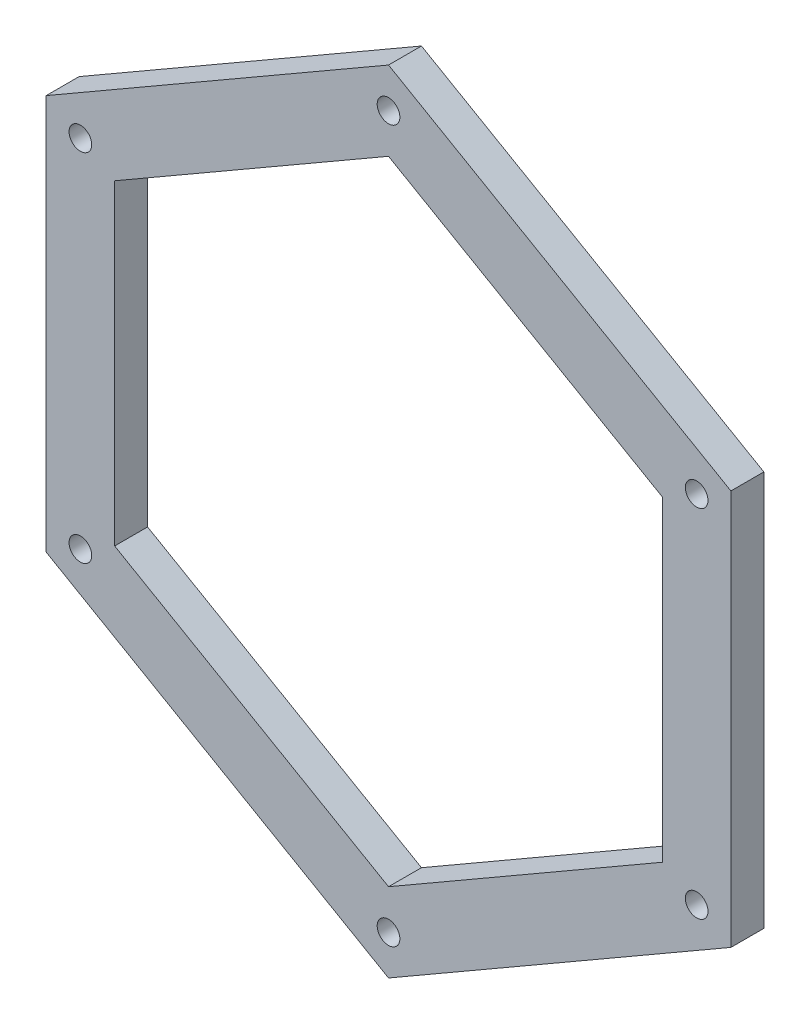
ISO-10303-21;
HEADER;
FILE_DESCRIPTION(('STEP AP214'),'2;1');
FILE_NAME('part.step','',(''),(''),'','','');
FILE_SCHEMA(('AUTOMOTIVE_DESIGN { 1 0 10303 214 1 1 1 1 }'));
ENDSEC;
DATA;
#1=APPLICATION_CONTEXT('core data for automotive mechanical design processes');
#2=APPLICATION_PROTOCOL_DEFINITION('international standard','automotive_design',2000,#1);
#3=PRODUCT_CONTEXT('',#1,'mechanical');
#4=PRODUCT('Part','Part','',(#3));
#5=PRODUCT_RELATED_PRODUCT_CATEGORY('part','',(#4));
#6=PRODUCT_DEFINITION_FORMATION('','',#4);
#7=PRODUCT_DEFINITION_CONTEXT('part definition',#1,'design');
#8=PRODUCT_DEFINITION('design','',#6,#7);
#9=PRODUCT_DEFINITION_SHAPE('','',#8);
#10=(LENGTH_UNIT() NAMED_UNIT(*) SI_UNIT(.MILLI.,.METRE.));
#11=(NAMED_UNIT(*) PLANE_ANGLE_UNIT() SI_UNIT($,.RADIAN.));
#12=(NAMED_UNIT(*) SI_UNIT($,.STERADIAN.) SOLID_ANGLE_UNIT());
#13=UNCERTAINTY_MEASURE_WITH_UNIT(LENGTH_MEASURE(1.E-05),#10,'distance_accuracy_value','');
#14=(GEOMETRIC_REPRESENTATION_CONTEXT(3) GLOBAL_UNCERTAINTY_ASSIGNED_CONTEXT((#13)) GLOBAL_UNIT_ASSIGNED_CONTEXT((#10,
#11,#12)) REPRESENTATION_CONTEXT('',''));
#15=CARTESIAN_POINT('',(0.,0.,0.));
#16=DIRECTION('',(0.,0.,1.));
#17=DIRECTION('',(1.,0.,0.));
#18=AXIS2_PLACEMENT_3D('',#15,#16,#17);
#19=CARTESIAN_POINT('',(0.,0.,3.175));
#20=DIRECTION('',(0.,0.,1.));
#21=DIRECTION('',(1.,0.,0.));
#22=AXIS2_PLACEMENT_3D('',#19,#20,#21);
#23=PLANE('',#22);
#24=CARTESIAN_POINT('',(0.,-34.29,3.175));
#25=DIRECTION('',(0.,0.,1.));
#26=DIRECTION('',(1.,0.,0.));
#27=AXIS2_PLACEMENT_3D('',#24,#25,#26);
#28=CIRCLE('',#27,1.0922);
#29=CARTESIAN_POINT('',(1.09220000000002,-34.29,3.175));
#30=VERTEX_POINT('',#29);
#31=EDGE_CURVE('E330',#30,#30,#28,.T.);
#32=ORIENTED_EDGE('',*,*,#31,.F.);
#33=EDGE_LOOP('',(#32));
#34=FACE_BOUND('',#33,.T.);
#35=CARTESIAN_POINT('',(29.6960110957684,17.145,3.175));
#36=DIRECTION('',(0.,0.,1.));
#37=DIRECTION('',(1.,0.,0.));
#38=AXIS2_PLACEMENT_3D('',#35,#36,#37);
#39=CIRCLE('',#38,1.0922);
#40=CARTESIAN_POINT('',(30.7882110957684,17.145,3.175));
#41=VERTEX_POINT('',#40);
#42=EDGE_CURVE('E342',#41,#41,#39,.T.);
#43=ORIENTED_EDGE('',*,*,#42,.F.);
#44=EDGE_LOOP('',(#43));
#45=FACE_BOUND('',#44,.T.);
#46=DIRECTION('',(-0.866025403784438,0.5,0.));
#47=VECTOR('',#46,1.);
#48=CARTESIAN_POINT('',(26.3964543073497,15.24,3.175));
#49=LINE('',#48,#47);
#50=CARTESIAN_POINT('',(26.3964543073497,15.24,3.175));
#51=VERTEX_POINT('',#50);
#52=CARTESIAN_POINT('',(0.,30.48,3.175));
#53=VERTEX_POINT('',#52);
#54=EDGE_CURVE('E136',#51,#53,#49,.T.);
#55=ORIENTED_EDGE('',*,*,#54,.F.);
#56=DIRECTION('',(0.,1.,0.));
#57=VECTOR('',#56,1.);
#58=CARTESIAN_POINT('',(26.3964543073497,-15.24,3.175));
#59=LINE('',#58,#57);
#60=CARTESIAN_POINT('',(26.3964543073497,-15.24,3.175));
#61=VERTEX_POINT('',#60);
#62=EDGE_CURVE('E128',#61,#51,#59,.T.);
#63=ORIENTED_EDGE('',*,*,#62,.F.);
#64=DIRECTION('',(0.866025403784439,0.5,0.));
#65=VECTOR('',#64,1.);
#66=CARTESIAN_POINT('',(0.,-30.48,3.175));
#67=LINE('',#66,#65);
#68=CARTESIAN_POINT('',(0.,-30.48,3.175));
#69=VERTEX_POINT('',#68);
#70=EDGE_CURVE('E159',#69,#61,#67,.T.);
#71=ORIENTED_EDGE('',*,*,#70,.F.);
#72=DIRECTION('',(0.866025403784439,-0.5,0.));
#73=VECTOR('',#72,1.);
#74=CARTESIAN_POINT('',(-26.3964543073497,-15.24,3.175));
#75=LINE('',#74,#73);
#76=CARTESIAN_POINT('',(-26.3964543073497,-15.24,3.175));
#77=VERTEX_POINT('',#76);
#78=EDGE_CURVE('E157',#77,#69,#75,.T.);
#79=ORIENTED_EDGE('',*,*,#78,.F.);
#80=DIRECTION('',(0.,-1.,0.));
#81=VECTOR('',#80,1.);
#82=CARTESIAN_POINT('',(-26.3964543073497,15.24,3.175));
#83=LINE('',#82,#81);
#84=CARTESIAN_POINT('',(-26.3964543073497,15.24,3.175));
#85=VERTEX_POINT('',#84);
#86=EDGE_CURVE('E152',#85,#77,#83,.T.);
#87=ORIENTED_EDGE('',*,*,#86,.F.);
#88=DIRECTION('',(-0.866025403784439,-0.5,0.));
#89=VECTOR('',#88,1.);
#90=CARTESIAN_POINT('',(0.,30.48,3.175));
#91=LINE('',#90,#89);
#92=EDGE_CURVE('E150',#53,#85,#91,.T.);
#93=ORIENTED_EDGE('',*,*,#92,.F.);
#94=EDGE_LOOP('',(#55,#63,#71,#79,#87,#93));
#95=FACE_BOUND('',#94,.T.);
#96=CARTESIAN_POINT('',(-29.6960110957684,17.145,3.175));
#97=DIRECTION('',(0.,0.,1.));
#98=DIRECTION('',(1.,0.,0.));
#99=AXIS2_PLACEMENT_3D('',#96,#97,#98);
#100=CIRCLE('',#99,1.09220000000001);
#101=CARTESIAN_POINT('',(-28.6038110957684,17.145,3.175));
#102=VERTEX_POINT('',#101);
#103=EDGE_CURVE('E182',#102,#102,#100,.T.);
#104=ORIENTED_EDGE('',*,*,#103,.F.);
#105=EDGE_LOOP('',(#104));
#106=FACE_BOUND('',#105,.T.);
#107=DIRECTION('',(0.,1.,0.));
#108=VECTOR('',#107,1.);
#109=CARTESIAN_POINT('',(32.9955678841871,-19.05,3.175));
#110=LINE('',#109,#108);
#111=CARTESIAN_POINT('',(32.9955678841871,-19.05,3.175));
#112=VERTEX_POINT('',#111);
#113=CARTESIAN_POINT('',(32.9955678841871,19.05,3.175));
#114=VERTEX_POINT('',#113);
#115=EDGE_CURVE('E188',#112,#114,#110,.T.);
#116=ORIENTED_EDGE('',*,*,#115,.T.);
#117=DIRECTION('',(-0.866025403784439,0.5,0.));
#118=VECTOR('',#117,1.);
#119=CARTESIAN_POINT('',(32.9955678841871,19.05,3.175));
#120=LINE('',#119,#118);
#121=CARTESIAN_POINT('',(0.,38.1,3.175));
#122=VERTEX_POINT('',#121);
#123=EDGE_CURVE('E191',#114,#122,#120,.T.);
#124=ORIENTED_EDGE('',*,*,#123,.T.);
#125=DIRECTION('',(-0.866025403784438,-0.5,0.));
#126=VECTOR('',#125,1.);
#127=CARTESIAN_POINT('',(0.,38.1,3.175));
#128=LINE('',#127,#126);
#129=CARTESIAN_POINT('',(-32.9955678841871,19.05,3.175));
#130=VERTEX_POINT('',#129);
#131=EDGE_CURVE('E194',#122,#130,#128,.T.);
#132=ORIENTED_EDGE('',*,*,#131,.T.);
#133=DIRECTION('',(0.,-1.,0.));
#134=VECTOR('',#133,1.);
#135=CARTESIAN_POINT('',(-32.9955678841871,19.05,3.175));
#136=LINE('',#135,#134);
#137=CARTESIAN_POINT('',(-32.9955678841871,-19.05,3.175));
#138=VERTEX_POINT('',#137);
#139=EDGE_CURVE('E196',#130,#138,#136,.T.);
#140=ORIENTED_EDGE('',*,*,#139,.T.);
#141=DIRECTION('',(0.866025403784439,-0.5,0.));
#142=VECTOR('',#141,1.);
#143=CARTESIAN_POINT('',(-32.9955678841871,-19.05,3.175));
#144=LINE('',#143,#142);
#145=CARTESIAN_POINT('',(0.,-38.1,3.175));
#146=VERTEX_POINT('',#145);
#147=EDGE_CURVE('E198',#138,#146,#144,.T.);
#148=ORIENTED_EDGE('',*,*,#147,.T.);
#149=DIRECTION('',(0.866025403784438,0.5,0.));
#150=VECTOR('',#149,1.);
#151=CARTESIAN_POINT('',(0.,-38.1,3.175));
#152=LINE('',#151,#150);
#153=EDGE_CURVE('E200',#146,#112,#152,.T.);
#154=ORIENTED_EDGE('',*,*,#153,.T.);
#155=EDGE_LOOP('',(#116,#124,#132,#140,#148,#154));
#156=FACE_BOUND('',#155,.T.);
#157=CARTESIAN_POINT('',(0.,34.29,3.175));
#158=DIRECTION('',(0.,0.,1.));
#159=DIRECTION('',(1.,0.,0.));
#160=AXIS2_PLACEMENT_3D('',#157,#158,#159);
#161=CIRCLE('',#160,1.0922);
#162=CARTESIAN_POINT('',(1.0922,34.29,3.175));
#163=VERTEX_POINT('',#162);
#164=EDGE_CURVE('E162',#163,#163,#161,.T.);
#165=ORIENTED_EDGE('',*,*,#164,.F.);
#166=EDGE_LOOP('',(#165));
#167=FACE_BOUND('',#166,.T.);
#168=CARTESIAN_POINT('',(29.6960110957684,-17.145,3.175));
#169=DIRECTION('',(0.,0.,1.));
#170=DIRECTION('',(1.,0.,0.));
#171=AXIS2_PLACEMENT_3D('',#168,#169,#170);
#172=CIRCLE('',#171,1.09219999999999);
#173=CARTESIAN_POINT('',(30.7882110957684,-17.145,3.175));
#174=VERTEX_POINT('',#173);
#175=EDGE_CURVE('E336',#174,#174,#172,.T.);
#176=ORIENTED_EDGE('',*,*,#175,.F.);
#177=EDGE_LOOP('',(#176));
#178=FACE_BOUND('',#177,.T.);
#179=CARTESIAN_POINT('',(-29.6960110957684,-17.145,3.175));
#180=DIRECTION('',(0.,0.,1.));
#181=DIRECTION('',(1.,0.,0.));
#182=AXIS2_PLACEMENT_3D('',#179,#180,#181);
#183=CIRCLE('',#182,1.09220000000001);
#184=CARTESIAN_POINT('',(-28.6038110957684,-17.145,3.175));
#185=VERTEX_POINT('',#184);
#186=EDGE_CURVE('E321',#185,#185,#183,.T.);
#187=ORIENTED_EDGE('',*,*,#186,.F.);
#188=EDGE_LOOP('',(#187));
#189=FACE_BOUND('',#188,.T.);
#190=ADVANCED_FACE('F39',(#34,#45,#95,#106,#156,#167,#178,#189),#23,.T.);
#191=CARTESIAN_POINT('',(0.,0.,0.));
#192=DIRECTION('',(0.,0.,1.));
#193=DIRECTION('',(1.,0.,0.));
#194=AXIS2_PLACEMENT_3D('',#191,#192,#193);
#195=PLANE('',#194);
#196=CARTESIAN_POINT('',(-29.6960110957684,17.145,0.));
#197=DIRECTION('',(0.,0.,1.));
#198=DIRECTION('',(1.,0.,0.));
#199=AXIS2_PLACEMENT_3D('',#196,#197,#198);
#200=CIRCLE('',#199,1.09220000000001);
#201=CARTESIAN_POINT('',(-28.6038110957684,17.145,0.));
#202=VERTEX_POINT('',#201);
#203=EDGE_CURVE('E144',#202,#202,#200,.T.);
#204=ORIENTED_EDGE('',*,*,#203,.T.);
#205=EDGE_LOOP('',(#204));
#206=FACE_BOUND('',#205,.T.);
#207=DIRECTION('',(0.,1.,0.));
#208=VECTOR('',#207,1.);
#209=CARTESIAN_POINT('',(32.9955678841871,-19.05,0.));
#210=LINE('',#209,#208);
#211=CARTESIAN_POINT('',(32.9955678841871,-19.05,0.));
#212=VERTEX_POINT('',#211);
#213=CARTESIAN_POINT('',(32.9955678841871,19.05,0.));
#214=VERTEX_POINT('',#213);
#215=EDGE_CURVE('E185',#212,#214,#210,.T.);
#216=ORIENTED_EDGE('',*,*,#215,.F.);
#217=DIRECTION('',(0.866025403784438,0.5,0.));
#218=VECTOR('',#217,1.);
#219=CARTESIAN_POINT('',(0.,-38.1,0.));
#220=LINE('',#219,#218);
#221=CARTESIAN_POINT('',(0.,-38.1,0.));
#222=VERTEX_POINT('',#221);
#223=EDGE_CURVE('E192',#222,#212,#220,.T.);
#224=ORIENTED_EDGE('',*,*,#223,.F.);
#225=DIRECTION('',(0.866025403784439,-0.5,0.));
#226=VECTOR('',#225,1.);
#227=CARTESIAN_POINT('',(-32.9955678841871,-19.05,0.));
#228=LINE('',#227,#226);
#229=CARTESIAN_POINT('',(-32.9955678841871,-19.05,0.));
#230=VERTEX_POINT('',#229);
#231=EDGE_CURVE('E211',#230,#222,#228,.T.);
#232=ORIENTED_EDGE('',*,*,#231,.F.);
#233=DIRECTION('',(0.,-1.,0.));
#234=VECTOR('',#233,1.);
#235=CARTESIAN_POINT('',(-32.9955678841871,19.05,0.));
#236=LINE('',#235,#234);
#237=CARTESIAN_POINT('',(-32.9955678841871,19.05,0.));
#238=VERTEX_POINT('',#237);
#239=EDGE_CURVE('E209',#238,#230,#236,.T.);
#240=ORIENTED_EDGE('',*,*,#239,.F.);
#241=DIRECTION('',(-0.866025403784438,-0.5,0.));
#242=VECTOR('',#241,1.);
#243=CARTESIAN_POINT('',(0.,38.1,0.));
#244=LINE('',#243,#242);
#245=CARTESIAN_POINT('',(0.,38.1,0.));
#246=VERTEX_POINT('',#245);
#247=EDGE_CURVE('E207',#246,#238,#244,.T.);
#248=ORIENTED_EDGE('',*,*,#247,.F.);
#249=DIRECTION('',(-0.866025403784439,0.5,0.));
#250=VECTOR('',#249,1.);
#251=CARTESIAN_POINT('',(32.9955678841871,19.05,0.));
#252=LINE('',#251,#250);
#253=EDGE_CURVE('E205',#214,#246,#252,.T.);
#254=ORIENTED_EDGE('',*,*,#253,.F.);
#255=EDGE_LOOP('',(#216,#224,#232,#240,#248,#254));
#256=FACE_BOUND('',#255,.T.);
#257=DIRECTION('',(0.,1.,0.));
#258=VECTOR('',#257,1.);
#259=CARTESIAN_POINT('',(26.3964543073497,-15.24,0.));
#260=LINE('',#259,#258);
#261=CARTESIAN_POINT('',(26.3964543073497,-15.24,0.));
#262=VERTEX_POINT('',#261);
#263=CARTESIAN_POINT('',(26.3964543073497,15.24,0.));
#264=VERTEX_POINT('',#263);
#265=EDGE_CURVE('E62',#262,#264,#260,.T.);
#266=ORIENTED_EDGE('',*,*,#265,.T.);
#267=DIRECTION('',(-0.866025403784438,0.5,0.));
#268=VECTOR('',#267,1.);
#269=CARTESIAN_POINT('',(26.3964543073497,15.24,0.));
#270=LINE('',#269,#268);
#271=CARTESIAN_POINT('',(0.,30.48,0.));
#272=VERTEX_POINT('',#271);
#273=EDGE_CURVE('E143',#264,#272,#270,.T.);
#274=ORIENTED_EDGE('',*,*,#273,.T.);
#275=DIRECTION('',(-0.866025403784439,-0.5,0.));
#276=VECTOR('',#275,1.);
#277=CARTESIAN_POINT('',(0.,30.48,0.));
#278=LINE('',#277,#276);
#279=CARTESIAN_POINT('',(-26.3964543073497,15.24,0.));
#280=VERTEX_POINT('',#279);
#281=EDGE_CURVE('E164',#272,#280,#278,.T.);
#282=ORIENTED_EDGE('',*,*,#281,.T.);
#283=DIRECTION('',(0.,-1.,0.));
#284=VECTOR('',#283,1.);
#285=CARTESIAN_POINT('',(-26.3964543073497,15.24,0.));
#286=LINE('',#285,#284);
#287=CARTESIAN_POINT('',(-26.3964543073497,-15.24,0.));
#288=VERTEX_POINT('',#287);
#289=EDGE_CURVE('E167',#280,#288,#286,.T.);
#290=ORIENTED_EDGE('',*,*,#289,.T.);
#291=DIRECTION('',(0.866025403784439,-0.5,0.));
#292=VECTOR('',#291,1.);
#293=CARTESIAN_POINT('',(-26.3964543073497,-15.24,0.));
#294=LINE('',#293,#292);
#295=CARTESIAN_POINT('',(0.,-30.48,0.));
#296=VERTEX_POINT('',#295);
#297=EDGE_CURVE('E170',#288,#296,#294,.T.);
#298=ORIENTED_EDGE('',*,*,#297,.T.);
#299=DIRECTION('',(0.866025403784439,0.5,0.));
#300=VECTOR('',#299,1.);
#301=CARTESIAN_POINT('',(0.,-30.48,0.));
#302=LINE('',#301,#300);
#303=EDGE_CURVE('E137',#296,#262,#302,.T.);
#304=ORIENTED_EDGE('',*,*,#303,.T.);
#305=EDGE_LOOP('',(#266,#274,#282,#290,#298,#304));
#306=FACE_BOUND('',#305,.T.);
#307=CARTESIAN_POINT('',(0.,34.29,0.));
#308=DIRECTION('',(0.,0.,1.));
#309=DIRECTION('',(1.,0.,0.));
#310=AXIS2_PLACEMENT_3D('',#307,#308,#309);
#311=CIRCLE('',#310,1.0922);
#312=CARTESIAN_POINT('',(1.0922,34.29,0.));
#313=VERTEX_POINT('',#312);
#314=EDGE_CURVE('E345',#313,#313,#311,.T.);
#315=ORIENTED_EDGE('',*,*,#314,.T.);
#316=EDGE_LOOP('',(#315));
#317=FACE_BOUND('',#316,.T.);
#318=CARTESIAN_POINT('',(29.6960110957684,17.145,0.));
#319=DIRECTION('',(0.,0.,1.));
#320=DIRECTION('',(1.,0.,0.));
#321=AXIS2_PLACEMENT_3D('',#318,#319,#320);
#322=CIRCLE('',#321,1.0922);
#323=CARTESIAN_POINT('',(30.7882110957684,17.145,0.));
#324=VERTEX_POINT('',#323);
#325=EDGE_CURVE('E339',#324,#324,#322,.T.);
#326=ORIENTED_EDGE('',*,*,#325,.T.);
#327=EDGE_LOOP('',(#326));
#328=FACE_BOUND('',#327,.T.);
#329=CARTESIAN_POINT('',(29.6960110957684,-17.145,0.));
#330=DIRECTION('',(0.,0.,1.));
#331=DIRECTION('',(1.,0.,0.));
#332=AXIS2_PLACEMENT_3D('',#329,#330,#331);
#333=CIRCLE('',#332,1.09219999999999);
#334=CARTESIAN_POINT('',(30.7882110957684,-17.145,0.));
#335=VERTEX_POINT('',#334);
#336=EDGE_CURVE('E333',#335,#335,#333,.T.);
#337=ORIENTED_EDGE('',*,*,#336,.T.);
#338=EDGE_LOOP('',(#337));
#339=FACE_BOUND('',#338,.T.);
#340=CARTESIAN_POINT('',(0.,-34.29,0.));
#341=DIRECTION('',(0.,0.,1.));
#342=DIRECTION('',(1.,0.,0.));
#343=AXIS2_PLACEMENT_3D('',#340,#341,#342);
#344=CIRCLE('',#343,1.0922);
#345=CARTESIAN_POINT('',(1.09220000000002,-34.29,0.));
#346=VERTEX_POINT('',#345);
#347=EDGE_CURVE('E327',#346,#346,#344,.T.);
#348=ORIENTED_EDGE('',*,*,#347,.T.);
#349=EDGE_LOOP('',(#348));
#350=FACE_BOUND('',#349,.T.);
#351=CARTESIAN_POINT('',(-29.6960110957684,-17.145,0.));
#352=DIRECTION('',(0.,0.,1.));
#353=DIRECTION('',(1.,0.,0.));
#354=AXIS2_PLACEMENT_3D('',#351,#352,#353);
#355=CIRCLE('',#354,1.09220000000001);
#356=CARTESIAN_POINT('',(-28.6038110957684,-17.145,0.));
#357=VERTEX_POINT('',#356);
#358=EDGE_CURVE('E324',#357,#357,#355,.T.);
#359=ORIENTED_EDGE('',*,*,#358,.T.);
#360=EDGE_LOOP('',(#359));
#361=FACE_BOUND('',#360,.T.);
#362=ADVANCED_FACE('F235',(#206,#256,#306,#317,#328,#339,#350,#361),#195,.F.);
#363=CARTESIAN_POINT('',(32.9955678841871,-19.05,3.175));
#364=DIRECTION('',(-1.,0.,0.));
#365=DIRECTION('',(0.,-1.,0.));
#366=AXIS2_PLACEMENT_3D('',#363,#364,#365);
#367=PLANE('',#366);
#368=ORIENTED_EDGE('',*,*,#215,.T.);
#369=DIRECTION('',(0.,0.,-1.));
#370=VECTOR('',#369,1.);
#371=CARTESIAN_POINT('',(32.9955678841871,19.05,3.175));
#372=LINE('',#371,#370);
#373=EDGE_CURVE('E11',#114,#214,#372,.T.);
#374=ORIENTED_EDGE('',*,*,#373,.F.);
#375=ORIENTED_EDGE('',*,*,#115,.F.);
#376=DIRECTION('',(0.,0.,-1.));
#377=VECTOR('',#376,1.);
#378=CARTESIAN_POINT('',(32.9955678841871,-19.05,3.175));
#379=LINE('',#378,#377);
#380=EDGE_CURVE('E202',#112,#212,#379,.T.);
#381=ORIENTED_EDGE('',*,*,#380,.T.);
#382=EDGE_LOOP('',(#368,#374,#375,#381));
#383=FACE_BOUND('',#382,.T.);
#384=ADVANCED_FACE('F41',(#383),#367,.F.);
#385=CARTESIAN_POINT('',(32.9955678841871,19.05,3.175));
#386=DIRECTION('',(-0.5,-0.866025403784439,0.));
#387=DIRECTION('',(0.866025403784439,-0.5,0.));
#388=AXIS2_PLACEMENT_3D('',#385,#386,#387);
#389=PLANE('',#388);
#390=ORIENTED_EDGE('',*,*,#253,.T.);
#391=DIRECTION('',(0.,0.,-1.));
#392=VECTOR('',#391,1.);
#393=CARTESIAN_POINT('',(0.,38.1,3.175));
#394=LINE('',#393,#392);
#395=EDGE_CURVE('E47',#122,#246,#394,.T.);
#396=ORIENTED_EDGE('',*,*,#395,.F.);
#397=ORIENTED_EDGE('',*,*,#123,.F.);
#398=ORIENTED_EDGE('',*,*,#373,.T.);
#399=EDGE_LOOP('',(#390,#396,#397,#398));
#400=FACE_BOUND('',#399,.T.);
#401=ADVANCED_FACE('F253',(#400),#389,.F.);
#402=CARTESIAN_POINT('',(0.,38.1,3.175));
#403=DIRECTION('',(0.5,-0.866025403784438,0.));
#404=DIRECTION('',(0.866025403784438,0.5,0.));
#405=AXIS2_PLACEMENT_3D('',#402,#403,#404);
#406=PLANE('',#405);
#407=ORIENTED_EDGE('',*,*,#247,.T.);
#408=DIRECTION('',(0.,0.,-1.));
#409=VECTOR('',#408,1.);
#410=CARTESIAN_POINT('',(-32.9955678841871,19.05,3.175));
#411=LINE('',#410,#409);
#412=EDGE_CURVE('E222',#130,#238,#411,.T.);
#413=ORIENTED_EDGE('',*,*,#412,.F.);
#414=ORIENTED_EDGE('',*,*,#131,.F.);
#415=ORIENTED_EDGE('',*,*,#395,.T.);
#416=EDGE_LOOP('',(#407,#413,#414,#415));
#417=FACE_BOUND('',#416,.T.);
#418=ADVANCED_FACE('F229',(#417),#406,.F.);
#419=CARTESIAN_POINT('',(-32.9955678841871,19.05,3.175));
#420=DIRECTION('',(1.,0.,0.));
#421=DIRECTION('',(0.,1.,0.));
#422=AXIS2_PLACEMENT_3D('',#419,#420,#421);
#423=PLANE('',#422);
#424=ORIENTED_EDGE('',*,*,#239,.T.);
#425=DIRECTION('',(0.,0.,-1.));
#426=VECTOR('',#425,1.);
#427=CARTESIAN_POINT('',(-32.9955678841871,-19.05,3.175));
#428=LINE('',#427,#426);
#429=EDGE_CURVE('E219',#138,#230,#428,.T.);
#430=ORIENTED_EDGE('',*,*,#429,.F.);
#431=ORIENTED_EDGE('',*,*,#139,.F.);
#432=ORIENTED_EDGE('',*,*,#412,.T.);
#433=EDGE_LOOP('',(#424,#430,#431,#432));
#434=FACE_BOUND('',#433,.T.);
#435=ADVANCED_FACE('F241',(#434),#423,.F.);
#436=CARTESIAN_POINT('',(-32.9955678841871,-19.05,3.175));
#437=DIRECTION('',(0.5,0.866025403784439,0.));
#438=DIRECTION('',(-0.866025403784439,0.5,0.));
#439=AXIS2_PLACEMENT_3D('',#436,#437,#438);
#440=PLANE('',#439);
#441=ORIENTED_EDGE('',*,*,#231,.T.);
#442=DIRECTION('',(0.,0.,-1.));
#443=VECTOR('',#442,1.);
#444=CARTESIAN_POINT('',(0.,-38.1,3.175));
#445=LINE('',#444,#443);
#446=EDGE_CURVE('E216',#146,#222,#445,.T.);
#447=ORIENTED_EDGE('',*,*,#446,.F.);
#448=ORIENTED_EDGE('',*,*,#147,.F.);
#449=ORIENTED_EDGE('',*,*,#429,.T.);
#450=EDGE_LOOP('',(#441,#447,#448,#449));
#451=FACE_BOUND('',#450,.T.);
#452=ADVANCED_FACE('F245',(#451),#440,.F.);
#453=CARTESIAN_POINT('',(0.,-38.1,3.175));
#454=DIRECTION('',(-0.5,0.866025403784439,0.));
#455=DIRECTION('',(-0.866025403784439,-0.5,0.));
#456=AXIS2_PLACEMENT_3D('',#453,#454,#455);
#457=PLANE('',#456);
#458=ORIENTED_EDGE('',*,*,#223,.T.);
#459=ORIENTED_EDGE('',*,*,#380,.F.);
#460=ORIENTED_EDGE('',*,*,#153,.F.);
#461=ORIENTED_EDGE('',*,*,#446,.T.);
#462=EDGE_LOOP('',(#458,#459,#460,#461));
#463=FACE_BOUND('',#462,.T.);
#464=ADVANCED_FACE('F256',(#463),#457,.F.);
#465=CARTESIAN_POINT('',(-29.6960110957684,17.145,3.175));
#466=DIRECTION('',(0.,0.,-1.));
#467=DIRECTION('',(-1.,0.,0.));
#468=AXIS2_PLACEMENT_3D('',#465,#466,#467);
#469=CYLINDRICAL_SURFACE('',#468,1.09220000000001);
#470=ORIENTED_EDGE('',*,*,#103,.T.);
#471=EDGE_LOOP('',(#470));
#472=FACE_BOUND('',#471,.T.);
#473=ORIENTED_EDGE('',*,*,#203,.F.);
#474=EDGE_LOOP('',(#473));
#475=FACE_BOUND('',#474,.T.);
#476=ADVANCED_FACE('F258',(#472,#475),#469,.F.);
#477=CARTESIAN_POINT('',(26.3964543073497,-15.24,3.175));
#478=DIRECTION('',(-1.,0.,0.));
#479=DIRECTION('',(0.,-1.,0.));
#480=AXIS2_PLACEMENT_3D('',#477,#478,#479);
#481=PLANE('',#480);
#482=ORIENTED_EDGE('',*,*,#265,.F.);
#483=DIRECTION('',(0.,0.,-1.));
#484=VECTOR('',#483,1.);
#485=CARTESIAN_POINT('',(26.3964543073497,-15.24,3.175));
#486=LINE('',#485,#484);
#487=EDGE_CURVE('E132',#61,#262,#486,.T.);
#488=ORIENTED_EDGE('',*,*,#487,.F.);
#489=ORIENTED_EDGE('',*,*,#62,.T.);
#490=DIRECTION('',(0.,0.,-1.));
#491=VECTOR('',#490,1.);
#492=CARTESIAN_POINT('',(26.3964543073497,15.24,3.175));
#493=LINE('',#492,#491);
#494=EDGE_CURVE('E131',#51,#264,#493,.T.);
#495=ORIENTED_EDGE('',*,*,#494,.T.);
#496=EDGE_LOOP('',(#482,#488,#489,#495));
#497=FACE_BOUND('',#496,.T.);
#498=ADVANCED_FACE('F130',(#497),#481,.T.);
#499=CARTESIAN_POINT('',(26.3964543073497,15.24,3.175));
#500=DIRECTION('',(-0.5,-0.866025403784439,0.));
#501=DIRECTION('',(0.866025403784439,-0.5,0.));
#502=AXIS2_PLACEMENT_3D('',#499,#500,#501);
#503=PLANE('',#502);
#504=ORIENTED_EDGE('',*,*,#273,.F.);
#505=ORIENTED_EDGE('',*,*,#494,.F.);
#506=ORIENTED_EDGE('',*,*,#54,.T.);
#507=DIRECTION('',(0.,0.,-1.));
#508=VECTOR('',#507,1.);
#509=CARTESIAN_POINT('',(0.,30.48,3.175));
#510=LINE('',#509,#508);
#511=EDGE_CURVE('E145',#53,#272,#510,.T.);
#512=ORIENTED_EDGE('',*,*,#511,.T.);
#513=EDGE_LOOP('',(#504,#505,#506,#512));
#514=FACE_BOUND('',#513,.T.);
#515=ADVANCED_FACE('F140',(#514),#503,.T.);
#516=CARTESIAN_POINT('',(0.,30.48,3.175));
#517=DIRECTION('',(0.5,-0.866025403784439,0.));
#518=DIRECTION('',(0.866025403784439,0.5,0.));
#519=AXIS2_PLACEMENT_3D('',#516,#517,#518);
#520=PLANE('',#519);
#521=ORIENTED_EDGE('',*,*,#281,.F.);
#522=ORIENTED_EDGE('',*,*,#511,.F.);
#523=ORIENTED_EDGE('',*,*,#92,.T.);
#524=DIRECTION('',(0.,0.,-1.));
#525=VECTOR('',#524,1.);
#526=CARTESIAN_POINT('',(-26.3964543073497,15.24,3.175));
#527=LINE('',#526,#525);
#528=EDGE_CURVE('E179',#85,#280,#527,.T.);
#529=ORIENTED_EDGE('',*,*,#528,.T.);
#530=EDGE_LOOP('',(#521,#522,#523,#529));
#531=FACE_BOUND('',#530,.T.);
#532=ADVANCED_FACE('F282',(#531),#520,.T.);
#533=CARTESIAN_POINT('',(-26.3964543073497,15.24,3.175));
#534=DIRECTION('',(1.,0.,0.));
#535=DIRECTION('',(0.,1.,0.));
#536=AXIS2_PLACEMENT_3D('',#533,#534,#535);
#537=PLANE('',#536);
#538=ORIENTED_EDGE('',*,*,#289,.F.);
#539=ORIENTED_EDGE('',*,*,#528,.F.);
#540=ORIENTED_EDGE('',*,*,#86,.T.);
#541=DIRECTION('',(0.,0.,-1.));
#542=VECTOR('',#541,1.);
#543=CARTESIAN_POINT('',(-26.3964543073497,-15.24,3.175));
#544=LINE('',#543,#542);
#545=EDGE_CURVE('E177',#77,#288,#544,.T.);
#546=ORIENTED_EDGE('',*,*,#545,.T.);
#547=EDGE_LOOP('',(#538,#539,#540,#546));
#548=FACE_BOUND('',#547,.T.);
#549=ADVANCED_FACE('F285',(#548),#537,.T.);
#550=CARTESIAN_POINT('',(-26.3964543073497,-15.24,3.175));
#551=DIRECTION('',(0.5,0.866025403784439,0.));
#552=DIRECTION('',(-0.866025403784439,0.5,0.));
#553=AXIS2_PLACEMENT_3D('',#550,#551,#552);
#554=PLANE('',#553);
#555=ORIENTED_EDGE('',*,*,#297,.F.);
#556=ORIENTED_EDGE('',*,*,#545,.F.);
#557=ORIENTED_EDGE('',*,*,#78,.T.);
#558=DIRECTION('',(0.,0.,-1.));
#559=VECTOR('',#558,1.);
#560=CARTESIAN_POINT('',(0.,-30.48,3.175));
#561=LINE('',#560,#559);
#562=EDGE_CURVE('E54',#69,#296,#561,.T.);
#563=ORIENTED_EDGE('',*,*,#562,.T.);
#564=EDGE_LOOP('',(#555,#556,#557,#563));
#565=FACE_BOUND('',#564,.T.);
#566=ADVANCED_FACE('F289',(#565),#554,.T.);
#567=CARTESIAN_POINT('',(0.,-30.48,3.175));
#568=DIRECTION('',(-0.5,0.866025403784439,0.));
#569=DIRECTION('',(-0.866025403784439,-0.5,0.));
#570=AXIS2_PLACEMENT_3D('',#567,#568,#569);
#571=PLANE('',#570);
#572=ORIENTED_EDGE('',*,*,#303,.F.);
#573=ORIENTED_EDGE('',*,*,#562,.F.);
#574=ORIENTED_EDGE('',*,*,#70,.T.);
#575=ORIENTED_EDGE('',*,*,#487,.T.);
#576=EDGE_LOOP('',(#572,#573,#574,#575));
#577=FACE_BOUND('',#576,.T.);
#578=ADVANCED_FACE('F293',(#577),#571,.T.);
#579=CARTESIAN_POINT('',(0.,34.29,3.175));
#580=DIRECTION('',(0.,0.,-1.));
#581=DIRECTION('',(-1.,0.,0.));
#582=AXIS2_PLACEMENT_3D('',#579,#580,#581);
#583=CYLINDRICAL_SURFACE('',#582,1.0922);
#584=ORIENTED_EDGE('',*,*,#164,.T.);
#585=EDGE_LOOP('',(#584));
#586=FACE_BOUND('',#585,.T.);
#587=ORIENTED_EDGE('',*,*,#314,.F.);
#588=EDGE_LOOP('',(#587));
#589=FACE_BOUND('',#588,.T.);
#590=ADVANCED_FACE('F297',(#586,#589),#583,.F.);
#591=CARTESIAN_POINT('',(29.6960110957684,17.145,3.175));
#592=DIRECTION('',(0.,0.,-1.));
#593=DIRECTION('',(-1.,0.,0.));
#594=AXIS2_PLACEMENT_3D('',#591,#592,#593);
#595=CYLINDRICAL_SURFACE('',#594,1.0922);
#596=ORIENTED_EDGE('',*,*,#42,.T.);
#597=EDGE_LOOP('',(#596));
#598=FACE_BOUND('',#597,.T.);
#599=ORIENTED_EDGE('',*,*,#325,.F.);
#600=EDGE_LOOP('',(#599));
#601=FACE_BOUND('',#600,.T.);
#602=ADVANCED_FACE('F300',(#598,#601),#595,.F.);
#603=CARTESIAN_POINT('',(29.6960110957684,-17.145,3.175));
#604=DIRECTION('',(0.,0.,-1.));
#605=DIRECTION('',(-1.,0.,0.));
#606=AXIS2_PLACEMENT_3D('',#603,#604,#605);
#607=CYLINDRICAL_SURFACE('',#606,1.09219999999999);
#608=ORIENTED_EDGE('',*,*,#175,.T.);
#609=EDGE_LOOP('',(#608));
#610=FACE_BOUND('',#609,.T.);
#611=ORIENTED_EDGE('',*,*,#336,.F.);
#612=EDGE_LOOP('',(#611));
#613=FACE_BOUND('',#612,.T.);
#614=ADVANCED_FACE('F304',(#610,#613),#607,.F.);
#615=CARTESIAN_POINT('',(0.,-34.29,3.175));
#616=DIRECTION('',(0.,0.,-1.));
#617=DIRECTION('',(-1.,0.,0.));
#618=AXIS2_PLACEMENT_3D('',#615,#616,#617);
#619=CYLINDRICAL_SURFACE('',#618,1.0922);
#620=ORIENTED_EDGE('',*,*,#31,.T.);
#621=EDGE_LOOP('',(#620));
#622=FACE_BOUND('',#621,.T.);
#623=ORIENTED_EDGE('',*,*,#347,.F.);
#624=EDGE_LOOP('',(#623));
#625=FACE_BOUND('',#624,.T.);
#626=ADVANCED_FACE('F308',(#622,#625),#619,.F.);
#627=CARTESIAN_POINT('',(-29.6960110957684,-17.145,3.175));
#628=DIRECTION('',(0.,0.,-1.));
#629=DIRECTION('',(-1.,0.,0.));
#630=AXIS2_PLACEMENT_3D('',#627,#628,#629);
#631=CYLINDRICAL_SURFACE('',#630,1.09220000000001);
#632=ORIENTED_EDGE('',*,*,#186,.T.);
#633=EDGE_LOOP('',(#632));
#634=FACE_BOUND('',#633,.T.);
#635=ORIENTED_EDGE('',*,*,#358,.F.);
#636=EDGE_LOOP('',(#635));
#637=FACE_BOUND('',#636,.T.);
#638=ADVANCED_FACE('F312',(#634,#637),#631,.F.);
#639=CLOSED_SHELL('',(#190,#362,#384,#401,#418,#435,#452,#464,#476,#498,#515,#532,#549,#566,
#578,#590,#602,#614,#626,#638));
#640=MANIFOLD_SOLID_BREP('B2',#639);
#641=ADVANCED_BREP_SHAPE_REPRESENTATION('',(#18,#640),#14);
#642=SHAPE_DEFINITION_REPRESENTATION(#9,#641);
ENDSEC;
END-ISO-10303-21;
